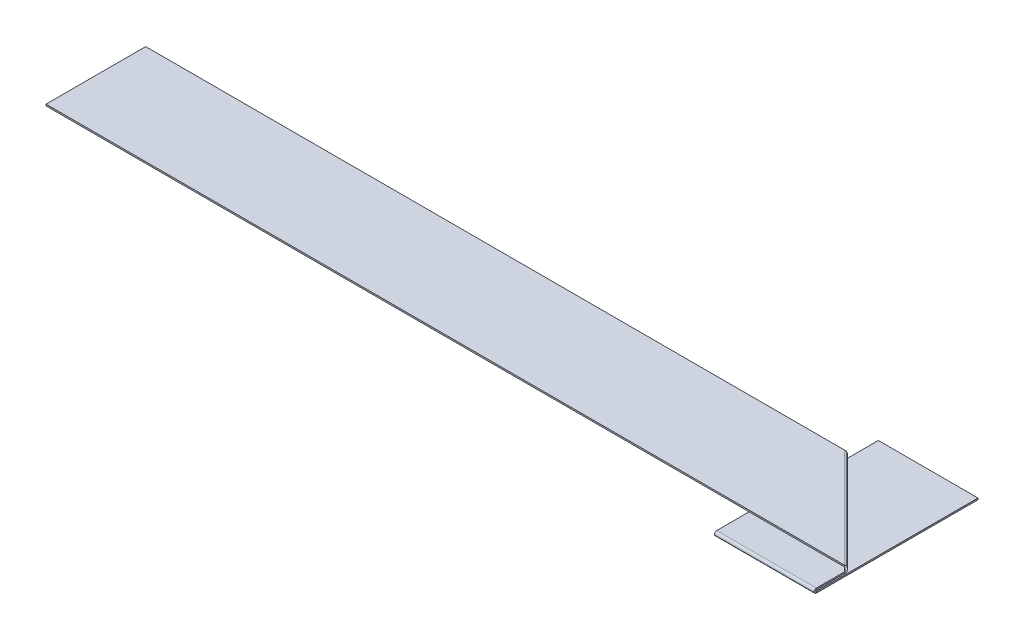
ISO-10303-21;
HEADER;
FILE_DESCRIPTION(('STEP AP214'),'2;1');
FILE_NAME('part.step','',(''),(''),'','','');
FILE_SCHEMA(('AUTOMOTIVE_DESIGN { 1 0 10303 214 1 1 1 1 }'));
ENDSEC;
DATA;
#1=APPLICATION_CONTEXT('core data for automotive mechanical design processes');
#2=APPLICATION_PROTOCOL_DEFINITION('international standard','automotive_design',2000,#1);
#3=PRODUCT_CONTEXT('',#1,'mechanical');
#4=PRODUCT('Part','Part','',(#3));
#5=PRODUCT_RELATED_PRODUCT_CATEGORY('part','',(#4));
#6=PRODUCT_DEFINITION_FORMATION('','',#4);
#7=PRODUCT_DEFINITION_CONTEXT('part definition',#1,'design');
#8=PRODUCT_DEFINITION('design','',#6,#7);
#9=PRODUCT_DEFINITION_SHAPE('','',#8);
#10=(LENGTH_UNIT() NAMED_UNIT(*) SI_UNIT(.MILLI.,.METRE.));
#11=(NAMED_UNIT(*) PLANE_ANGLE_UNIT() SI_UNIT($,.RADIAN.));
#12=(NAMED_UNIT(*) SI_UNIT($,.STERADIAN.) SOLID_ANGLE_UNIT());
#13=UNCERTAINTY_MEASURE_WITH_UNIT(LENGTH_MEASURE(1.E-05),#10,'distance_accuracy_value','');
#14=(GEOMETRIC_REPRESENTATION_CONTEXT(3) GLOBAL_UNCERTAINTY_ASSIGNED_CONTEXT((#13)) GLOBAL_UNIT_ASSIGNED_CONTEXT((#10,
#11,#12)) REPRESENTATION_CONTEXT('',''));
#15=CARTESIAN_POINT('',(0.,0.,0.));
#16=DIRECTION('',(0.,0.,1.));
#17=DIRECTION('',(1.,0.,0.));
#18=AXIS2_PLACEMENT_3D('',#15,#16,#17);
#19=CARTESIAN_POINT('',(0.,0.700000000000186,52.6));
#20=DIRECTION('',(0.,-1.,0.));
#21=DIRECTION('',(0.,0.,-1.));
#22=AXIS2_PLACEMENT_3D('',#19,#20,#21);
#23=PLANE('',#22);
#24=DIRECTION('',(0.,0.,-1.));
#25=VECTOR('',#24,1.);
#26=CARTESIAN_POINT('',(16.,0.700000000000186,52.6));
#27=LINE('',#26,#25);
#28=CARTESIAN_POINT('',(16.,0.7,25.9465708264711));
#29=VERTEX_POINT('',#28);
#30=CARTESIAN_POINT('',(16.,0.699999999999969,21.4463951570139));
#31=VERTEX_POINT('',#30);
#32=EDGE_CURVE('E80',#29,#31,#27,.T.);
#33=ORIENTED_EDGE('',*,*,#32,.T.);
#34=DIRECTION('',(-0.707106781186553,0.,-0.707106781186542));
#35=VECTOR('',#34,1.);
#36=CARTESIAN_POINT('',(23.5768024214929,0.700000000000022,29.0231975785067));
#37=LINE('',#36,#35);
#38=CARTESIAN_POINT('',(0.,0.699999999999857,5.44639515701414));
#39=VERTEX_POINT('',#38);
#40=EDGE_CURVE('E73',#31,#39,#37,.T.);
#41=ORIENTED_EDGE('',*,*,#40,.T.);
#42=DIRECTION('',(0.,0.,1.));
#43=VECTOR('',#42,1.);
#44=CARTESIAN_POINT('',(0.,0.700000000000186,52.6));
#45=LINE('',#44,#43);
#46=CARTESIAN_POINT('',(0.,0.7,25.9465708264711));
#47=VERTEX_POINT('',#46);
#48=EDGE_CURVE('E88',#39,#47,#45,.T.);
#49=ORIENTED_EDGE('',*,*,#48,.T.);
#50=DIRECTION('',(-1.,0.,0.));
#51=VECTOR('',#50,1.);
#52=CARTESIAN_POINT('',(0.,0.7,25.9465708264711));
#53=LINE('',#52,#51);
#54=EDGE_CURVE('E350',#29,#47,#53,.T.);
#55=ORIENTED_EDGE('',*,*,#54,.F.);
#56=EDGE_LOOP('',(#33,#41,#49,#55));
#57=FACE_BOUND('',#56,.T.);
#58=ADVANCED_FACE('F61',(#57),#23,.F.);
#59=CARTESIAN_POINT('',(0.,0.450000000000186,52.6));
#60=DIRECTION('',(-1.,0.,0.));
#61=DIRECTION('',(0.,0.,-1.));
#62=AXIS2_PLACEMENT_3D('',#59,#60,#61);
#63=PLANE('',#62);
#64=CARTESIAN_POINT('',(0.,0.449999999999857,5.44639515701415));
#65=CARTESIAN_POINT('',(0.,0.699999999999857,5.44639515701415));
#66=B_SPLINE_CURVE_WITH_KNOTS('',1,(#64,#65),.UNSPECIFIED.,.F.,.F.,(2,2),(0.,1.),.UNSPECIFIED.);
#67=CARTESIAN_POINT('',(0.,0.449999999999857,5.44639515701414));
#68=VERTEX_POINT('',#67);
#69=EDGE_CURVE('E291',#68,#39,#66,.T.);
#70=ORIENTED_EDGE('',*,*,#69,.F.);
#71=DIRECTION('',(0.,0.,1.));
#72=VECTOR('',#71,1.);
#73=CARTESIAN_POINT('',(0.,0.450000000000186,52.6));
#74=LINE('',#73,#72);
#75=CARTESIAN_POINT('',(0.,0.45,25.9465708264711));
#76=VERTEX_POINT('',#75);
#77=EDGE_CURVE('E357',#68,#76,#74,.T.);
#78=ORIENTED_EDGE('',*,*,#77,.T.);
#79=DIRECTION('',(0.,1.,0.));
#80=VECTOR('',#79,1.);
#81=CARTESIAN_POINT('',(0.,0.449999999999998,25.9465708264711));
#82=LINE('',#81,#80);
#83=EDGE_CURVE('E353',#76,#47,#82,.T.);
#84=ORIENTED_EDGE('',*,*,#83,.T.);
#85=ORIENTED_EDGE('',*,*,#48,.F.);
#86=EDGE_LOOP('',(#70,#78,#84,#85));
#87=FACE_BOUND('',#86,.T.);
#88=ADVANCED_FACE('F388',(#87),#63,.T.);
#89=CARTESIAN_POINT('',(16.,0.450000000000186,52.6));
#90=DIRECTION('',(1.,0.,0.));
#91=DIRECTION('',(0.,0.,1.));
#92=AXIS2_PLACEMENT_3D('',#89,#90,#91);
#93=PLANE('',#92);
#94=CARTESIAN_POINT('',(16.,0.699999999999969,21.4463951570139));
#95=CARTESIAN_POINT('',(16.,0.449999999999969,21.4463951570139));
#96=B_SPLINE_CURVE_WITH_KNOTS('',1,(#94,#95),.UNSPECIFIED.,.F.,.F.,(2,2),(0.,1.),.UNSPECIFIED.);
#97=CARTESIAN_POINT('',(16.,0.449999999999969,21.4463951570139));
#98=VERTEX_POINT('',#97);
#99=EDGE_CURVE('E12',#31,#98,#96,.T.);
#100=ORIENTED_EDGE('',*,*,#99,.F.);
#101=ORIENTED_EDGE('',*,*,#32,.F.);
#102=DIRECTION('',(0.,-1.,0.));
#103=VECTOR('',#102,1.);
#104=CARTESIAN_POINT('',(16.,0.449999999999998,25.9465708264712));
#105=LINE('',#104,#103);
#106=CARTESIAN_POINT('',(16.,0.45,25.9465708264711));
#107=VERTEX_POINT('',#106);
#108=EDGE_CURVE('E346',#29,#107,#105,.T.);
#109=ORIENTED_EDGE('',*,*,#108,.T.);
#110=DIRECTION('',(0.,0.,-1.));
#111=VECTOR('',#110,1.);
#112=CARTESIAN_POINT('',(16.,0.450000000000186,52.6));
#113=LINE('',#112,#111);
#114=EDGE_CURVE('E347',#107,#98,#113,.T.);
#115=ORIENTED_EDGE('',*,*,#114,.T.);
#116=EDGE_LOOP('',(#100,#101,#109,#115));
#117=FACE_BOUND('',#116,.T.);
#118=ADVANCED_FACE('F63',(#117),#93,.T.);
#119=CARTESIAN_POINT('',(0.,0.450000000000186,52.6));
#120=DIRECTION('',(0.,-1.,0.));
#121=DIRECTION('',(0.,0.,-1.));
#122=AXIS2_PLACEMENT_3D('',#119,#120,#121);
#123=PLANE('',#122);
#124=DIRECTION('',(-0.707106781186553,0.,-0.707106781186542));
#125=VECTOR('',#124,1.);
#126=CARTESIAN_POINT('',(23.5768024214929,0.450000000000021,29.0231975785067));
#127=LINE('',#126,#125);
#128=EDGE_CURVE('E355',#98,#68,#127,.T.);
#129=ORIENTED_EDGE('',*,*,#128,.F.);
#130=ORIENTED_EDGE('',*,*,#114,.F.);
#131=DIRECTION('',(-1.,0.,0.));
#132=VECTOR('',#131,1.);
#133=CARTESIAN_POINT('',(0.,0.45,25.9465708264711));
#134=LINE('',#133,#132);
#135=EDGE_CURVE('E343',#107,#76,#134,.T.);
#136=ORIENTED_EDGE('',*,*,#135,.T.);
#137=ORIENTED_EDGE('',*,*,#77,.F.);
#138=EDGE_LOOP('',(#129,#130,#136,#137));
#139=FACE_BOUND('',#138,.T.);
#140=ADVANCED_FACE('F397',(#139),#123,.T.);
#141=CARTESIAN_POINT('',(0.,0.25,0.));
#142=DIRECTION('',(0.,0.,-1.));
#143=DIRECTION('',(-1.,0.,0.));
#144=AXIS2_PLACEMENT_3D('',#141,#142,#143);
#145=PLANE('',#144);
#146=DIRECTION('',(1.,0.,0.));
#147=VECTOR('',#146,1.);
#148=CARTESIAN_POINT('',(0.,0.,0.));
#149=LINE('',#148,#147);
#150=CARTESIAN_POINT('',(0.,0.,0.));
#151=VERTEX_POINT('',#150);
#152=CARTESIAN_POINT('',(16.,0.,0.));
#153=VERTEX_POINT('',#152);
#154=EDGE_CURVE('E318',#151,#153,#149,.T.);
#155=ORIENTED_EDGE('',*,*,#154,.F.);
#156=DIRECTION('',(0.,-1.,0.));
#157=VECTOR('',#156,1.);
#158=CARTESIAN_POINT('',(0.,0.25,0.));
#159=LINE('',#158,#157);
#160=CARTESIAN_POINT('',(0.,0.25,0.));
#161=VERTEX_POINT('',#160);
#162=EDGE_CURVE('E313',#161,#151,#159,.T.);
#163=ORIENTED_EDGE('',*,*,#162,.F.);
#164=DIRECTION('',(1.,0.,0.));
#165=VECTOR('',#164,1.);
#166=CARTESIAN_POINT('',(0.,0.25,0.));
#167=LINE('',#166,#165);
#168=CARTESIAN_POINT('',(16.,0.25,0.));
#169=VERTEX_POINT('',#168);
#170=EDGE_CURVE('E332',#161,#169,#167,.T.);
#171=ORIENTED_EDGE('',*,*,#170,.T.);
#172=DIRECTION('',(0.,-1.,0.));
#173=VECTOR('',#172,1.);
#174=CARTESIAN_POINT('',(16.,0.25,0.));
#175=LINE('',#174,#173);
#176=EDGE_CURVE('E330',#169,#153,#175,.T.);
#177=ORIENTED_EDGE('',*,*,#176,.T.);
#178=EDGE_LOOP('',(#155,#163,#171,#177));
#179=FACE_BOUND('',#178,.T.);
#180=ADVANCED_FACE('F419',(#179),#145,.T.);
#181=CARTESIAN_POINT('',(0.,0.25,0.));
#182=DIRECTION('',(0.,1.,0.));
#183=DIRECTION('',(0.,0.,1.));
#184=AXIS2_PLACEMENT_3D('',#181,#182,#183);
#185=PLANE('',#184);
#186=DIRECTION('',(-1.,0.,0.));
#187=VECTOR('',#186,1.);
#188=CARTESIAN_POINT('',(0.,0.25,25.9465708264711));
#189=LINE('',#188,#187);
#190=CARTESIAN_POINT('',(16.,0.25,25.9465708264711));
#191=VERTEX_POINT('',#190);
#192=CARTESIAN_POINT('',(0.,0.25,25.9465708264711));
#193=VERTEX_POINT('',#192);
#194=EDGE_CURVE('E307',#191,#193,#189,.T.);
#195=ORIENTED_EDGE('',*,*,#194,.F.);
#196=DIRECTION('',(0.,0.,1.));
#197=VECTOR('',#196,1.);
#198=CARTESIAN_POINT('',(16.,0.25,0.));
#199=LINE('',#198,#197);
#200=EDGE_CURVE('E328',#169,#191,#199,.T.);
#201=ORIENTED_EDGE('',*,*,#200,.F.);
#202=ORIENTED_EDGE('',*,*,#170,.F.);
#203=DIRECTION('',(0.,0.,-1.));
#204=VECTOR('',#203,1.);
#205=CARTESIAN_POINT('',(0.,0.25,0.));
#206=LINE('',#205,#204);
#207=EDGE_CURVE('E316',#193,#161,#206,.T.);
#208=ORIENTED_EDGE('',*,*,#207,.F.);
#209=EDGE_LOOP('',(#195,#201,#202,#208));
#210=FACE_BOUND('',#209,.T.);
#211=ADVANCED_FACE('F427',(#210),#185,.T.);
#212=CARTESIAN_POINT('',(16.,0.25,0.));
#213=DIRECTION('',(1.,0.,0.));
#214=DIRECTION('',(0.,0.,-1.));
#215=AXIS2_PLACEMENT_3D('',#212,#213,#214);
#216=PLANE('',#215);
#217=DIRECTION('',(0.,1.,0.));
#218=VECTOR('',#217,1.);
#219=CARTESIAN_POINT('',(16.,0.250000000000002,25.9465708264711));
#220=LINE('',#219,#218);
#221=CARTESIAN_POINT('',(16.,0.,25.9465708264711));
#222=VERTEX_POINT('',#221);
#223=EDGE_CURVE('E335',#222,#191,#220,.T.);
#224=ORIENTED_EDGE('',*,*,#223,.F.);
#225=DIRECTION('',(0.,0.,1.));
#226=VECTOR('',#225,1.);
#227=CARTESIAN_POINT('',(16.,0.,0.));
#228=LINE('',#227,#226);
#229=EDGE_CURVE('E326',#153,#222,#228,.T.);
#230=ORIENTED_EDGE('',*,*,#229,.F.);
#231=ORIENTED_EDGE('',*,*,#176,.F.);
#232=ORIENTED_EDGE('',*,*,#200,.T.);
#233=EDGE_LOOP('',(#224,#230,#231,#232));
#234=FACE_BOUND('',#233,.T.);
#235=ADVANCED_FACE('F435',(#234),#216,.T.);
#236=CARTESIAN_POINT('',(0.,0.,0.));
#237=DIRECTION('',(0.,1.,0.));
#238=DIRECTION('',(0.,0.,1.));
#239=AXIS2_PLACEMENT_3D('',#236,#237,#238);
#240=PLANE('',#239);
#241=ORIENTED_EDGE('',*,*,#229,.T.);
#242=DIRECTION('',(-1.,0.,0.));
#243=VECTOR('',#242,1.);
#244=CARTESIAN_POINT('',(0.,0.,25.9465708264711));
#245=LINE('',#244,#243);
#246=CARTESIAN_POINT('',(0.,0.,25.9465708264711));
#247=VERTEX_POINT('',#246);
#248=EDGE_CURVE('E323',#222,#247,#245,.T.);
#249=ORIENTED_EDGE('',*,*,#248,.T.);
#250=DIRECTION('',(0.,0.,-1.));
#251=VECTOR('',#250,1.);
#252=CARTESIAN_POINT('',(0.,0.,0.));
#253=LINE('',#252,#251);
#254=EDGE_CURVE('E321',#247,#151,#253,.T.);
#255=ORIENTED_EDGE('',*,*,#254,.T.);
#256=ORIENTED_EDGE('',*,*,#154,.T.);
#257=EDGE_LOOP('',(#241,#249,#255,#256));
#258=FACE_BOUND('',#257,.T.);
#259=ADVANCED_FACE('F443',(#258),#240,.F.);
#260=CARTESIAN_POINT('',(0.,0.25,0.));
#261=DIRECTION('',(-1.,0.,0.));
#262=DIRECTION('',(0.,0.,1.));
#263=AXIS2_PLACEMENT_3D('',#260,#261,#262);
#264=PLANE('',#263);
#265=DIRECTION('',(0.,-1.,0.));
#266=VECTOR('',#265,1.);
#267=CARTESIAN_POINT('',(0.,0.250000000000002,25.9465708264711));
#268=LINE('',#267,#266);
#269=EDGE_CURVE('E338',#193,#247,#268,.T.);
#270=ORIENTED_EDGE('',*,*,#269,.F.);
#271=ORIENTED_EDGE('',*,*,#207,.T.);
#272=ORIENTED_EDGE('',*,*,#162,.T.);
#273=ORIENTED_EDGE('',*,*,#254,.F.);
#274=EDGE_LOOP('',(#270,#271,#272,#273));
#275=FACE_BOUND('',#274,.T.);
#276=ADVANCED_FACE('F452',(#275),#264,.T.);
#277=CARTESIAN_POINT('',(16.,0.35,25.9465708264712));
#278=DIRECTION('',(-1.,0.,0.));
#279=DIRECTION('',(0.,0.,1.));
#280=AXIS2_PLACEMENT_3D('',#277,#278,#279);
#281=PLANE('',#280);
#282=ORIENTED_EDGE('',*,*,#108,.F.);
#283=CARTESIAN_POINT('',(16.,0.35,25.9465708264712));
#284=DIRECTION('',(1.,0.,0.));
#285=DIRECTION('',(0.,0.,-1.));
#286=AXIS2_PLACEMENT_3D('',#283,#284,#285);
#287=CIRCLE('',#286,0.35);
#288=EDGE_CURVE('E308',#29,#222,#287,.T.);
#289=ORIENTED_EDGE('',*,*,#288,.T.);
#290=ORIENTED_EDGE('',*,*,#223,.T.);
#291=CARTESIAN_POINT('',(16.,0.35,25.9465708264712));
#292=DIRECTION('',(1.,0.,0.));
#293=DIRECTION('',(0.,0.,1.));
#294=AXIS2_PLACEMENT_3D('',#291,#292,#293);
#295=CIRCLE('',#294,0.1);
#296=EDGE_CURVE('E295',#107,#191,#295,.T.);
#297=ORIENTED_EDGE('',*,*,#296,.F.);
#298=EDGE_LOOP('',(#282,#289,#290,#297));
#299=FACE_BOUND('',#298,.T.);
#300=ADVANCED_FACE('F460',(#299),#281,.F.);
#301=CARTESIAN_POINT('',(0.,0.35,25.9465708264711));
#302=DIRECTION('',(1.,0.,0.));
#303=DIRECTION('',(0.,0.,-1.));
#304=AXIS2_PLACEMENT_3D('',#301,#302,#303);
#305=PLANE('',#304);
#306=CARTESIAN_POINT('',(0.,0.35,25.9465708264711));
#307=DIRECTION('',(1.,0.,0.));
#308=DIRECTION('',(0.,0.,-1.));
#309=AXIS2_PLACEMENT_3D('',#306,#307,#308);
#310=CIRCLE('',#309,0.35);
#311=EDGE_CURVE('E304',#247,#47,#310,.F.);
#312=ORIENTED_EDGE('',*,*,#311,.T.);
#313=ORIENTED_EDGE('',*,*,#83,.F.);
#314=CARTESIAN_POINT('',(0.,0.35,25.9465708264711));
#315=DIRECTION('',(-1.,0.,0.));
#316=DIRECTION('',(0.,0.,-1.));
#317=AXIS2_PLACEMENT_3D('',#314,#315,#316);
#318=CIRCLE('',#317,0.1);
#319=EDGE_CURVE('E303',#193,#76,#318,.T.);
#320=ORIENTED_EDGE('',*,*,#319,.F.);
#321=ORIENTED_EDGE('',*,*,#269,.T.);
#322=EDGE_LOOP('',(#312,#313,#320,#321));
#323=FACE_BOUND('',#322,.T.);
#324=ADVANCED_FACE('F467',(#323),#305,.F.);
#325=CARTESIAN_POINT('',(-8.01755751426557,0.35,25.9465708264711));
#326=DIRECTION('',(1.,0.,0.));
#327=DIRECTION('',(0.,0.,-1.));
#328=AXIS2_PLACEMENT_3D('',#325,#326,#327);
#329=CYLINDRICAL_SURFACE('',#328,0.1);
#330=ORIENTED_EDGE('',*,*,#194,.T.);
#331=ORIENTED_EDGE('',*,*,#319,.T.);
#332=ORIENTED_EDGE('',*,*,#135,.F.);
#333=ORIENTED_EDGE('',*,*,#296,.T.);
#334=EDGE_LOOP('',(#330,#331,#332,#333));
#335=FACE_BOUND('',#334,.T.);
#336=ADVANCED_FACE('F266',(#335),#329,.F.);
#337=CARTESIAN_POINT('',(-8.01755751426557,0.35,25.9465708264711));
#338=DIRECTION('',(1.,0.,0.));
#339=DIRECTION('',(0.,0.,-1.));
#340=AXIS2_PLACEMENT_3D('',#337,#338,#339);
#341=CYLINDRICAL_SURFACE('',#340,0.35);
#342=ORIENTED_EDGE('',*,*,#248,.F.);
#343=ORIENTED_EDGE('',*,*,#288,.F.);
#344=ORIENTED_EDGE('',*,*,#54,.T.);
#345=ORIENTED_EDGE('',*,*,#311,.F.);
#346=EDGE_LOOP('',(#342,#343,#344,#345));
#347=FACE_BOUND('',#346,.T.);
#348=ADVANCED_FACE('F484',(#347),#341,.T.);
#349=CARTESIAN_POINT('',(15.5001756694572,1.14999999999997,20.9465708264711));
#350=CARTESIAN_POINT('',(15.5537921167778,1.14999999999996,20.9188467692402));
#351=CARTESIAN_POINT('',(15.6101453208639,1.13555392953662,20.8940041537715));
#352=CARTESIAN_POINT('',(15.7189385122351,1.08115460482736,20.8595312620026));
#353=CARTESIAN_POINT('',(15.7712872506304,1.0412542066912,20.8499817803735));
#354=CARTESIAN_POINT('',(15.8646371181393,0.945401271251339,20.8535086403268));
#355=CARTESIAN_POINT('',(15.9055946098397,0.889541867676821,20.8666286193227));
#356=CARTESIAN_POINT('',(15.9434051297206,0.825137932580983,20.8959992493107));
#357=CARTESIAN_POINT('',(15.9474944555388,0.817961511614403,20.8994626067464));
#358=CARTESIAN_POINT('',(15.9524655671429,0.8089824600218,20.9040424880177));
#359=CARTESIAN_POINT('',(15.9534527650753,0.807186223669707,20.9049709956008));
#360=CARTESIAN_POINT('',(15.9554131052041,0.803593324876628,20.9068530803838));
#361=CARTESIAN_POINT('',(15.956798330561,0.801030319156768,20.9082187407443));
#362=CARTESIAN_POINT('',(15.9584604205842,0.797939361686363,20.9098808307675));
#363=CARTESIAN_POINT('',(15.9595718933146,0.795873565119803,20.911018040061));
#364=CARTESIAN_POINT('',(15.965145362113,0.785520422303536,20.9168507913483));
#365=CARTESIAN_POINT('',(15.9696556014412,0.777160402469436,20.9219865199785));
#366=CARTESIAN_POINT('',(15.9787555724703,0.760330208947424,20.9332204686465));
#367=CARTESIAN_POINT('',(15.9833452894171,0.751860036432698,20.9393187034382));
#368=CARTESIAN_POINT('',(15.9902734569162,0.739109515057901,20.949203951382));
#369=CARTESIAN_POINT('',(15.9925901291823,0.73485183603946,20.9526219989027));
#370=CARTESIAN_POINT('',(15.9960742359463,0.728459072471622,20.9579353437777));
#371=CARTESIAN_POINT('',(15.9972371225514,0.72632711281429,20.9597375030454));
#372=CARTESIAN_POINT('',(15.9995656428449,0.722061980314015,20.9634041984837));
#373=CARTESIAN_POINT('',(16.0010711164158,0.719307492132631,20.9658208875552));
#374=CARTESIAN_POINT('',(16.0283630676478,0.669410737341268,21.0101633255908));
#375=CARTESIAN_POINT('',(16.04743163502,0.60799594815056,21.0656042844826));
#376=CARTESIAN_POINT('',(16.0493082551769,0.497799445239296,21.2228384689838));
#377=CARTESIAN_POINT('',(16.030346900834,0.449999999999967,21.325377274625));
#378=CARTESIAN_POINT('',(16.,0.449999999999969,21.4463951570139));
#379=CARTESIAN_POINT('',(15.5001756694572,0.899999999999965,20.9465708264711));
#380=CARTESIAN_POINT('',(15.524736891742,0.899999999999965,20.9478966771094));
#381=CARTESIAN_POINT('',(15.5520966336831,0.895872551296153,20.9520528409523));
#382=CARTESIAN_POINT('',(15.60972336679,0.880329887093508,20.9687464074477));
#383=CARTESIAN_POINT('',(15.6399655980337,0.868929773340319,20.9813034329702));
#384=CARTESIAN_POINT('',(15.7012358199871,0.841543220357502,21.0169099384791));
#385=CARTESIAN_POINT('',(15.7322513428644,0.825583390764782,21.039971886298));
#386=CARTESIAN_POINT('',(15.767047616355,0.807182266451686,21.0723567626763));
#387=CARTESIAN_POINT('',(15.7709133820366,0.805131860461234,21.0760436802487));
#388=CARTESIAN_POINT('',(15.7757447685218,0.802566417149062,21.0807632866388));
#389=CARTESIAN_POINT('',(15.7767110056152,0.80205320676275,21.081712755061));
#390=CARTESIAN_POINT('',(15.7786433974061,0.801026664250441,21.0836227881817));
#391=CARTESIAN_POINT('',(15.7800216352644,0.80029437690191,21.084995436041));
#392=CARTESIAN_POINT('',(15.7816837252875,0.79941124619608,21.0866575260641));
#393=CARTESIAN_POINT('',(15.7828043896477,0.798821018605634,21.087785543728));
#394=CARTESIAN_POINT('',(15.7884704593349,0.795862977800986,21.0935256941263));
#395=CARTESIAN_POINT('',(15.7932040876996,0.793474400705529,21.0984380337202));
#396=CARTESIAN_POINT('',(15.8030661935997,0.788665773984955,21.1089098475171));
#397=CARTESIAN_POINT('',(15.8081946669197,0.786245724695033,21.1144693259357));
#398=CARTESIAN_POINT('',(15.8161789345776,0.782602718587948,21.1232984737206));
#399=CARTESIAN_POINT('',(15.8188889551489,0.781386238868394,21.1263231729361));
#400=CARTESIAN_POINT('',(15.8230263612382,0.779559734991869,21.1309832184857));
#401=CARTESIAN_POINT('',(15.8244175595085,0.778950603661202,21.1325570660882));
#402=CARTESIAN_POINT('',(15.8272239994966,0.777731994375409,21.1357458418319));
#403=CARTESIAN_POINT('',(15.8290549071749,0.776944997752157,21.1378370967961));
#404=CARTESIAN_POINT('',(15.8624363179796,0.762688782097482,21.176090075259));
#405=CARTESIAN_POINT('',(15.8944950251802,0.745141699471565,21.2185408943223));
#406=CARTESIAN_POINT('',(15.9518564897458,0.713656984354062,21.3202902344148));
#407=CARTESIAN_POINT('',(15.9764883683094,0.699999999999968,21.38000179587));
#408=CARTESIAN_POINT('',(16.,0.699999999999969,21.4463951570139));
#409=B_SPLINE_SURFACE_WITH_KNOTS('',1,3,((#349,#350,#351,#352,#353,#354,#355,#356,#357,#358,
#359,#360,#361,#362,#363,#364,#365,#366,#367,#368,#369,#370,#371,#372,#373,#374,#375,#376,#377,
#378),(#379,#380,#381,#382,#383,#384,#385,#386,#387,#388,#389,#390,#391,#392,#393,#394,#395,
#396,#397,#398,#399,#400,#401,#402,#403,#404,#405,#406,#407,#408)),.UNSPECIFIED.,.F.,.F.,.F.,(2,
2),(4,2,2,2,2,2,2,2,2,2,2,2,2,2,4),(0.,1.),(0.,0.125,0.25,0.375,0.390625,0.39453125,0.3984375,
0.40625,0.4375,0.46875,0.484375,0.4921875,0.5,0.75,1.),.UNSPECIFIED.);
#410=CARTESIAN_POINT('',(15.5001756694572,1.14999999999997,20.9465708264711));
#411=CARTESIAN_POINT('',(15.5001756694572,0.899999999999965,20.9465708264711));
#412=B_SPLINE_CURVE_WITH_KNOTS('',1,(#410,#411),.UNSPECIFIED.,.F.,.F.,(2,2),(0.,1.),.UNSPECIFIED.);
#413=CARTESIAN_POINT('',(15.5001756694572,0.899999999999965,20.9465708264711));
#414=VERTEX_POINT('',#413);
#415=CARTESIAN_POINT('',(15.5001756694572,1.14999999999997,20.9465708264711));
#416=VERTEX_POINT('',#415);
#417=EDGE_CURVE('E162',#414,#416,#412,.F.);
#418=CARTESIAN_POINT('',(15.5001756694572,0.899999999999965,20.9465708264711));
#419=CARTESIAN_POINT('',(15.524736891742,0.899999999999965,20.9478966771094));
#420=CARTESIAN_POINT('',(15.5520966336831,0.895872551296153,20.9520528409523));
#421=CARTESIAN_POINT('',(15.60972336679,0.880329887093508,20.9687464074477));
#422=CARTESIAN_POINT('',(15.6399655980337,0.868929773340319,20.9813034329702));
#423=CARTESIAN_POINT('',(15.7012358199871,0.841543220357502,21.0169099384791));
#424=CARTESIAN_POINT('',(15.7322513428644,0.825583390764782,21.039971886298));
#425=CARTESIAN_POINT('',(15.767047616355,0.807182266451686,21.0723567626763));
#426=CARTESIAN_POINT('',(15.7709133820366,0.805131860461234,21.0760436802487));
#427=CARTESIAN_POINT('',(15.7757447685218,0.802566417149062,21.0807632866388));
#428=CARTESIAN_POINT('',(15.7767110056152,0.80205320676275,21.081712755061));
#429=CARTESIAN_POINT('',(15.7786433974061,0.801026664250441,21.0836227881817));
#430=CARTESIAN_POINT('',(15.7800216352644,0.80029437690191,21.084995436041));
#431=CARTESIAN_POINT('',(15.7816837252875,0.79941124619608,21.0866575260641));
#432=CARTESIAN_POINT('',(15.7828043896477,0.798821018605634,21.087785543728));
#433=CARTESIAN_POINT('',(15.7884704593349,0.795862977800986,21.0935256941263));
#434=CARTESIAN_POINT('',(15.7932040876996,0.793474400705529,21.0984380337202));
#435=CARTESIAN_POINT('',(15.8030661935997,0.788665773984955,21.1089098475171));
#436=CARTESIAN_POINT('',(15.8081946669197,0.786245724695033,21.1144693259357));
#437=CARTESIAN_POINT('',(15.8161789345776,0.782602718587948,21.1232984737206));
#438=CARTESIAN_POINT('',(15.8188889551489,0.781386238868394,21.1263231729361));
#439=CARTESIAN_POINT('',(15.8230263612382,0.779559734991869,21.1309832184857));
#440=CARTESIAN_POINT('',(15.8244175595085,0.778950603661202,21.1325570660882));
#441=CARTESIAN_POINT('',(15.8272239994966,0.777731994375409,21.1357458418319));
#442=CARTESIAN_POINT('',(15.8290549071749,0.776944997752157,21.1378370967961));
#443=CARTESIAN_POINT('',(15.8624363179796,0.762688782097482,21.176090075259));
#444=CARTESIAN_POINT('',(15.8944950251802,0.745141699471565,21.2185408943223));
#445=CARTESIAN_POINT('',(15.9518564897458,0.713656984354062,21.3202902344148));
#446=CARTESIAN_POINT('',(15.9764883683094,0.699999999999968,21.38000179587));
#447=CARTESIAN_POINT('',(16.,0.699999999999969,21.4463951570139));
#448=B_SPLINE_CURVE_WITH_KNOTS('',3,(#418,#419,#420,#421,#422,#423,#424,#425,#426,#427,#428,
#429,#430,#431,#432,#433,#434,#435,#436,#437,#438,#439,#440,#441,#442,#443,#444,#445,#446,#447),
.UNSPECIFIED.,.F.,.F.,(4,2,2,2,2,2,2,2,2,2,2,2,2,2,4),(0.,0.125,0.25,0.375,0.390625,0.39453125,
0.3984375,0.40625,0.4375,0.46875,0.484375,0.4921875,0.5,0.75,1.),.UNSPECIFIED.);
#449=EDGE_CURVE('E173',#414,#31,#448,.T.);
#450=CARTESIAN_POINT('',(16.,0.449999999999969,21.4463951570139));
#451=CARTESIAN_POINT('',(16.030346900834,0.449999999999967,21.325377274625));
#452=CARTESIAN_POINT('',(16.0493082551769,0.497799445239296,21.2228384689838));
#453=CARTESIAN_POINT('',(16.04743163502,0.60799594815056,21.0656042844826));
#454=CARTESIAN_POINT('',(16.0283630676478,0.669410737341268,21.0101633255908));
#455=CARTESIAN_POINT('',(16.0010711164158,0.719307492132631,20.9658208875552));
#456=CARTESIAN_POINT('',(15.9995656428449,0.722061980314015,20.9634041984837));
#457=CARTESIAN_POINT('',(15.9972371225514,0.72632711281429,20.9597375030454));
#458=CARTESIAN_POINT('',(15.9960742359463,0.728459072471622,20.9579353437777));
#459=CARTESIAN_POINT('',(15.9925901291823,0.73485183603946,20.9526219989027));
#460=CARTESIAN_POINT('',(15.9902734569162,0.739109515057901,20.949203951382));
#461=CARTESIAN_POINT('',(15.9833452894171,0.751860036432698,20.9393187034382));
#462=CARTESIAN_POINT('',(15.9787555724703,0.760330208947424,20.9332204686465));
#463=CARTESIAN_POINT('',(15.9696556014412,0.777160402469436,20.9219865199785));
#464=CARTESIAN_POINT('',(15.965145362113,0.785520422303536,20.9168507913483));
#465=CARTESIAN_POINT('',(15.9595718933146,0.795873565119803,20.911018040061));
#466=CARTESIAN_POINT('',(15.9584604205842,0.797939361686363,20.9098808307675));
#467=CARTESIAN_POINT('',(15.956798330561,0.801030319156768,20.9082187407443));
#468=CARTESIAN_POINT('',(15.9554131052041,0.803593324876628,20.9068530803838));
#469=CARTESIAN_POINT('',(15.9534527650753,0.807186223669707,20.9049709956008));
#470=CARTESIAN_POINT('',(15.9524655671429,0.8089824600218,20.9040424880177));
#471=CARTESIAN_POINT('',(15.9474944555388,0.817961511614403,20.8994626067464));
#472=CARTESIAN_POINT('',(15.9434051297206,0.825137932580983,20.8959992493107));
#473=CARTESIAN_POINT('',(15.9055946098397,0.889541867676821,20.8666286193227));
#474=CARTESIAN_POINT('',(15.8646371181393,0.945401271251339,20.8535086403268));
#475=CARTESIAN_POINT('',(15.7712872506304,1.0412542066912,20.8499817803735));
#476=CARTESIAN_POINT('',(15.7189385122351,1.08115460482736,20.8595312620026));
#477=CARTESIAN_POINT('',(15.6101453208639,1.13555392953662,20.8940041537715));
#478=CARTESIAN_POINT('',(15.5537921167778,1.14999999999996,20.9188467692402));
#479=CARTESIAN_POINT('',(15.5001756694572,1.14999999999997,20.9465708264711));
#480=B_SPLINE_CURVE_WITH_KNOTS('',3,(#450,#451,#452,#453,#454,#455,#456,#457,#458,#459,#460,
#461,#462,#463,#464,#465,#466,#467,#468,#469,#470,#471,#472,#473,#474,#475,#476,#477,#478,#479),
.UNSPECIFIED.,.F.,.F.,(4,2,2,2,2,2,2,2,2,2,2,2,2,2,4),(0.,0.25,0.5,0.5078125,0.515625,0.53125,
0.5625,0.59375,0.6015625,0.60546875,0.609375,0.625,0.75,0.875,1.),.UNSPECIFIED.);
#481=EDGE_CURVE('E692',#416,#98,#480,.F.);
#482=ORIENTED_EDGE('',*,*,#417,.F.);
#483=ORIENTED_EDGE('',*,*,#449,.T.);
#484=ORIENTED_EDGE('',*,*,#99,.T.);
#485=ORIENTED_EDGE('',*,*,#481,.F.);
#486=EDGE_LOOP('',(#482,#483,#484,#485));
#487=FACE_BOUND('',#486,.T.);
#488=ADVANCED_FACE('F262',(#487),#409,.T.);
#489=CARTESIAN_POINT('',(0.,0.449999999999857,5.44639515701415));
#490=CARTESIAN_POINT('',(0.0277240572302306,0.449999999999856,5.39277870969282));
#491=CARTESIAN_POINT('',(0.0525666726983777,0.464446070463198,5.33642550560617));
#492=CARTESIAN_POINT('',(0.0870395644667371,0.518845395172456,5.22763231423449));
#493=CARTESIAN_POINT('',(0.0965890460958461,0.558745793308619,5.17528357583914));
#494=CARTESIAN_POINT('',(0.0930621861428258,0.654598728748481,5.08193370833055));
#495=CARTESIAN_POINT('',(0.0799422071473748,0.710458132322999,5.04097621663062));
#496=CARTESIAN_POINT('',(0.0505715771601462,0.774862067418839,5.0031656967504));
#497=CARTESIAN_POINT('',(0.0471082197244624,0.782038488385419,4.99907637093227));
#498=CARTESIAN_POINT('',(0.0425283384532411,0.791017539978021,4.99410525932832));
#499=CARTESIAN_POINT('',(0.0415998308701916,0.792813776330115,4.99311806139595));
#500=CARTESIAN_POINT('',(0.0397177460872692,0.796406675123194,4.99115772126722));
#501=CARTESIAN_POINT('',(0.0383520857268205,0.798969680842937,4.98977249591037));
#502=CARTESIAN_POINT('',(0.0366899957035194,0.802060638313692,4.98811040588707));
#503=CARTESIAN_POINT('',(0.0355527864098715,0.804126434880469,4.98699893315654));
#504=CARTESIAN_POINT('',(0.0297200351222074,0.814479577697726,4.98142546435775));
#505=CARTESIAN_POINT('',(0.0245843064916406,0.822839597532326,4.97691522502939));
#506=CARTESIAN_POINT('',(0.0133503578233911,0.839669791054758,4.96781525400021));
#507=CARTESIAN_POINT('',(0.00725212303167213,0.848139963569403,4.96322553705345));
#508=CARTESIAN_POINT('',(-0.00263312491183633,0.860890484943654,4.95629736955456));
#509=CARTESIAN_POINT('',(-0.00605117243241564,0.865148163961842,4.95398069728857));
#510=CARTESIAN_POINT('',(-0.0113645173071304,0.871540927529198,4.95049659052476));
#511=CARTESIAN_POINT('',(-0.013166676574731,0.873672887186352,4.94933370391974));
#512=CARTESIAN_POINT('',(-0.0168333720128226,0.877938019686238,4.94700518362637));
#513=CARTESIAN_POINT('',(-0.0192500610849962,0.880692507868256,4.94549971005501));
#514=CARTESIAN_POINT('',(-0.0635924990905825,0.930589262624218,4.91820775884085));
#515=CARTESIAN_POINT('',(-0.11903345795612,0.992004051803425,4.89913919146563));
#516=CARTESIAN_POINT('',(-0.276267642445491,1.10220055473132,4.89726257129694));
#517=CARTESIAN_POINT('',(-0.378806448103792,1.14999999999985,4.91622392563519));
#518=CARTESIAN_POINT('',(-0.499824330542792,1.14999999999985,4.94657082647134));
#519=CARTESIAN_POINT('',(0.,0.699999999999857,5.44639515701415));
#520=CARTESIAN_POINT('',(-0.00132585063898564,0.699999999999857,5.4218339347286));
#521=CARTESIAN_POINT('',(-0.00548201448245698,0.704127448703668,5.394474192787));
#522=CARTESIAN_POINT('',(-0.0221755809783994,0.719670112906313,5.33684745967962));
#523=CARTESIAN_POINT('',(-0.0347326065008797,0.731070226659503,5.30660522843587));
#524=CARTESIAN_POINT('',(-0.0703391120094624,0.75845677964232,5.24533500648284));
#525=CARTESIAN_POINT('',(-0.0934010598279408,0.77441660923504,5.21431948360594));
#526=CARTESIAN_POINT('',(-0.125785936205522,0.792817733548137,5.17952321011607));
#527=CARTESIAN_POINT('',(-0.129472853777794,0.794868139538588,5.17565744443453));
#528=CARTESIAN_POINT('',(-0.134192460167847,0.79743358285076,5.17082605794941));
#529=CARTESIAN_POINT('',(-0.135141928589941,0.797946793237073,5.16985982085608));
#530=CARTESIAN_POINT('',(-0.137051961710651,0.798973335749381,5.16792742906514));
#531=CARTESIAN_POINT('',(-0.138424609569815,0.799705623097879,5.16654919120701));
#532=CARTESIAN_POINT('',(-0.140086699593116,0.800588753803809,5.1648871011837));
#533=CARTESIAN_POINT('',(-0.141214717257079,0.801178981394317,5.16376643682349));
#534=CARTESIAN_POINT('',(-0.146954867655859,0.804137022199247,5.15810036713582));
#535=CARTESIAN_POINT('',(-0.151867207249925,0.806525599294847,5.15336673877095));
#536=CARTESIAN_POINT('',(-0.162339021047075,0.811334226015542,5.14350463287068));
#537=CARTESIAN_POINT('',(-0.167898499465597,0.81375427530544,5.13837615955072));
#538=CARTESIAN_POINT('',(-0.17672764725031,0.817397281412369,5.13039189189304));
#539=CARTESIAN_POINT('',(-0.179752346465681,0.818613761131851,5.12768187132184));
#540=CARTESIAN_POINT('',(-0.184412392015073,0.820440265008239,5.1235444652327));
#541=CARTESIAN_POINT('',(-0.185986239617467,0.821049396338854,5.12215326696248));
#542=CARTESIAN_POINT('',(-0.189175015361015,0.822268005624536,5.11934682697456));
#543=CARTESIAN_POINT('',(-0.191266270325753,0.823055002247969,5.11751591929577));
#544=CARTESIAN_POINT('',(-0.229519248762973,0.83731121789253,5.08413450851325));
#545=CARTESIAN_POINT('',(-0.271970067810541,0.854858300515161,5.05207580132006));
#546=CARTESIAN_POINT('',(-0.373719407899672,0.886343015637416,4.99471433675112));
#547=CARTESIAN_POINT('',(-0.433430969368271,0.899999999999853,4.97008245817813));
#548=CARTESIAN_POINT('',(-0.499824330542792,0.899999999999853,4.94657082647134));
#549=B_SPLINE_SURFACE_WITH_KNOTS('',1,3,((#489,#490,#491,#492,#493,#494,#495,#496,#497,#498,
#499,#500,#501,#502,#503,#504,#505,#506,#507,#508,#509,#510,#511,#512,#513,#514,#515,#516,#517,
#518),(#519,#520,#521,#522,#523,#524,#525,#526,#527,#528,#529,#530,#531,#532,#533,#534,#535,
#536,#537,#538,#539,#540,#541,#542,#543,#544,#545,#546,#547,#548)),.UNSPECIFIED.,.F.,.F.,.F.,(2,
2),(4,2,2,2,2,2,2,2,2,2,2,2,2,2,4),(0.,1.),(0.,0.125,0.25,0.375,0.390625,0.39453125,0.3984375,
0.40625,0.4375,0.46875,0.484375,0.4921875,0.5,0.75,1.),.UNSPECIFIED.);
#550=CARTESIAN_POINT('',(0.,0.699999999999857,5.44639515701415));
#551=CARTESIAN_POINT('',(-0.00132585063898564,0.699999999999857,5.4218339347286));
#552=CARTESIAN_POINT('',(-0.00548201448245698,0.704127448703668,5.394474192787));
#553=CARTESIAN_POINT('',(-0.0221755809783994,0.719670112906313,5.33684745967962));
#554=CARTESIAN_POINT('',(-0.0347326065008797,0.731070226659503,5.30660522843587));
#555=CARTESIAN_POINT('',(-0.0703391120094624,0.75845677964232,5.24533500648284));
#556=CARTESIAN_POINT('',(-0.0934010598279408,0.77441660923504,5.21431948360594));
#557=CARTESIAN_POINT('',(-0.125785936205522,0.792817733548137,5.17952321011607));
#558=CARTESIAN_POINT('',(-0.129472853777794,0.794868139538588,5.17565744443453));
#559=CARTESIAN_POINT('',(-0.134192460167847,0.79743358285076,5.17082605794941));
#560=CARTESIAN_POINT('',(-0.135141928589941,0.797946793237073,5.16985982085608));
#561=CARTESIAN_POINT('',(-0.137051961710651,0.798973335749381,5.16792742906514));
#562=CARTESIAN_POINT('',(-0.138424609569815,0.799705623097879,5.16654919120701));
#563=CARTESIAN_POINT('',(-0.140086699593116,0.800588753803809,5.1648871011837));
#564=CARTESIAN_POINT('',(-0.141214717257079,0.801178981394317,5.16376643682349));
#565=CARTESIAN_POINT('',(-0.146954867655859,0.804137022199247,5.15810036713582));
#566=CARTESIAN_POINT('',(-0.151867207249925,0.806525599294847,5.15336673877095));
#567=CARTESIAN_POINT('',(-0.162339021047075,0.811334226015542,5.14350463287068));
#568=CARTESIAN_POINT('',(-0.167898499465597,0.81375427530544,5.13837615955072));
#569=CARTESIAN_POINT('',(-0.17672764725031,0.817397281412369,5.13039189189304));
#570=CARTESIAN_POINT('',(-0.179752346465681,0.818613761131851,5.12768187132184));
#571=CARTESIAN_POINT('',(-0.184412392015073,0.820440265008239,5.1235444652327));
#572=CARTESIAN_POINT('',(-0.185986239617467,0.821049396338854,5.12215326696248));
#573=CARTESIAN_POINT('',(-0.189175015361015,0.822268005624536,5.11934682697456));
#574=CARTESIAN_POINT('',(-0.191266270325753,0.823055002247969,5.11751591929577));
#575=CARTESIAN_POINT('',(-0.229519248762973,0.83731121789253,5.08413450851325));
#576=CARTESIAN_POINT('',(-0.271970067810541,0.854858300515161,5.05207580132006));
#577=CARTESIAN_POINT('',(-0.373719407899672,0.886343015637416,4.99471433675112));
#578=CARTESIAN_POINT('',(-0.433430969368271,0.899999999999853,4.97008245817813));
#579=CARTESIAN_POINT('',(-0.499824330542792,0.899999999999853,4.94657082647134));
#580=B_SPLINE_CURVE_WITH_KNOTS('',3,(#550,#551,#552,#553,#554,#555,#556,#557,#558,#559,#560,
#561,#562,#563,#564,#565,#566,#567,#568,#569,#570,#571,#572,#573,#574,#575,#576,#577,#578,#579),
.UNSPECIFIED.,.F.,.F.,(4,2,2,2,2,2,2,2,2,2,2,2,2,2,4),(0.,0.125,0.25,0.375,0.390625,0.39453125,
0.3984375,0.40625,0.4375,0.46875,0.484375,0.4921875,0.5,0.75,1.),.UNSPECIFIED.);
#581=CARTESIAN_POINT('',(-0.499824330542806,0.899999999999853,4.94657082647135));
#582=VERTEX_POINT('',#581);
#583=EDGE_CURVE('E234',#39,#582,#580,.T.);
#584=CARTESIAN_POINT('',(-0.499824330542792,0.899999999999853,4.94657082647134));
#585=CARTESIAN_POINT('',(-0.499824330542792,1.14999999999985,4.94657082647134));
#586=B_SPLINE_CURVE_WITH_KNOTS('',1,(#584,#585),.UNSPECIFIED.,.F.,.F.,(2,2),(0.,1.),.UNSPECIFIED.);
#587=CARTESIAN_POINT('',(-0.499824330542806,1.14999999999985,4.94657082647135));
#588=VERTEX_POINT('',#587);
#589=EDGE_CURVE('E680',#588,#582,#586,.F.);
#590=CARTESIAN_POINT('',(-0.499824330542792,1.14999999999985,4.94657082647134));
#591=CARTESIAN_POINT('',(-0.378806448103792,1.14999999999985,4.91622392563519));
#592=CARTESIAN_POINT('',(-0.276267642445491,1.10220055473132,4.89726257129694));
#593=CARTESIAN_POINT('',(-0.11903345795612,0.992004051803425,4.89913919146563));
#594=CARTESIAN_POINT('',(-0.0635924990905825,0.930589262624218,4.91820775884085));
#595=CARTESIAN_POINT('',(-0.0192500610849962,0.880692507868256,4.94549971005501));
#596=CARTESIAN_POINT('',(-0.0168333720128226,0.877938019686238,4.94700518362637));
#597=CARTESIAN_POINT('',(-0.013166676574731,0.873672887186352,4.94933370391974));
#598=CARTESIAN_POINT('',(-0.0113645173071304,0.871540927529198,4.95049659052476));
#599=CARTESIAN_POINT('',(-0.00605117243241564,0.865148163961842,4.95398069728857));
#600=CARTESIAN_POINT('',(-0.00263312491183633,0.860890484943654,4.95629736955456));
#601=CARTESIAN_POINT('',(0.00725212303167213,0.848139963569403,4.96322553705345));
#602=CARTESIAN_POINT('',(0.0133503578233911,0.839669791054758,4.96781525400021));
#603=CARTESIAN_POINT('',(0.0245843064916406,0.822839597532326,4.97691522502939));
#604=CARTESIAN_POINT('',(0.0297200351222074,0.814479577697726,4.98142546435775));
#605=CARTESIAN_POINT('',(0.0355527864098715,0.804126434880469,4.98699893315654));
#606=CARTESIAN_POINT('',(0.0366899957035194,0.802060638313692,4.98811040588707));
#607=CARTESIAN_POINT('',(0.0383520857268205,0.798969680842937,4.98977249591037));
#608=CARTESIAN_POINT('',(0.0397177460872692,0.796406675123194,4.99115772126722));
#609=CARTESIAN_POINT('',(0.0415998308701916,0.792813776330115,4.99311806139595));
#610=CARTESIAN_POINT('',(0.0425283384532411,0.791017539978021,4.99410525932832));
#611=CARTESIAN_POINT('',(0.0471082197244624,0.782038488385419,4.99907637093227));
#612=CARTESIAN_POINT('',(0.0505715771601462,0.774862067418839,5.0031656967504));
#613=CARTESIAN_POINT('',(0.0799422071473748,0.710458132322999,5.04097621663062));
#614=CARTESIAN_POINT('',(0.0930621861428258,0.654598728748481,5.08193370833055));
#615=CARTESIAN_POINT('',(0.0965890460958461,0.558745793308619,5.17528357583914));
#616=CARTESIAN_POINT('',(0.0870395644667371,0.518845395172456,5.22763231423449));
#617=CARTESIAN_POINT('',(0.0525666726983777,0.464446070463198,5.33642550560617));
#618=CARTESIAN_POINT('',(0.0277240572302306,0.449999999999856,5.39277870969282));
#619=CARTESIAN_POINT('',(0.,0.449999999999857,5.44639515701415));
#620=B_SPLINE_CURVE_WITH_KNOTS('',3,(#590,#591,#592,#593,#594,#595,#596,#597,#598,#599,#600,
#601,#602,#603,#604,#605,#606,#607,#608,#609,#610,#611,#612,#613,#614,#615,#616,#617,#618,#619),
.UNSPECIFIED.,.F.,.F.,(4,2,2,2,2,2,2,2,2,2,2,2,2,2,4),(0.,0.25,0.5,0.5078125,0.515625,0.53125,
0.5625,0.59375,0.6015625,0.60546875,0.609375,0.625,0.75,0.875,1.),.UNSPECIFIED.);
#621=EDGE_CURVE('E228',#68,#588,#620,.F.);
#622=ORIENTED_EDGE('',*,*,#583,.T.);
#623=ORIENTED_EDGE('',*,*,#589,.F.);
#624=ORIENTED_EDGE('',*,*,#621,.F.);
#625=ORIENTED_EDGE('',*,*,#69,.T.);
#626=EDGE_LOOP('',(#622,#623,#624,#625));
#627=FACE_BOUND('',#626,.T.);
#628=ADVANCED_FACE('F204',(#627),#549,.T.);
#629=CARTESIAN_POINT('',(-8.50833962881108,0.799999999999798,-3.06194447179683));
#630=DIRECTION('',(0.707106781186553,0.,0.707106781186542));
#631=DIRECTION('',(0.707106781186542,0.,-0.707106781186553));
#632=AXIS2_PLACEMENT_3D('',#629,#630,#631);
#633=CYLINDRICAL_SURFACE('',#632,0.35);
#634=ORIENTED_EDGE('',*,*,#128,.T.);
#635=ORIENTED_EDGE('',*,*,#621,.T.);
#636=DIRECTION('',(-0.707106781186553,0.,-0.707106781186542));
#637=VECTOR('',#636,1.);
#638=CARTESIAN_POINT('',(23.5768024214929,1.15000000000002,29.0231975785067));
#639=LINE('',#638,#637);
#640=EDGE_CURVE('E182',#416,#588,#639,.T.);
#641=ORIENTED_EDGE('',*,*,#640,.F.);
#642=ORIENTED_EDGE('',*,*,#481,.T.);
#643=EDGE_LOOP('',(#634,#635,#641,#642));
#644=FACE_BOUND('',#643,.T.);
#645=ADVANCED_FACE('F194',(#644),#633,.T.);
#646=CARTESIAN_POINT('',(-8.50833962881108,0.799999999999798,-3.06194447179683));
#647=DIRECTION('',(0.707106781186553,0.,0.707106781186542));
#648=DIRECTION('',(0.707106781186542,0.,-0.707106781186553));
#649=AXIS2_PLACEMENT_3D('',#646,#647,#648);
#650=CYLINDRICAL_SURFACE('',#649,0.1);
#651=ORIENTED_EDGE('',*,*,#40,.F.);
#652=ORIENTED_EDGE('',*,*,#449,.F.);
#653=DIRECTION('',(-0.707106781186553,0.,-0.707106781186542));
#654=VECTOR('',#653,1.);
#655=CARTESIAN_POINT('',(23.5768024214929,0.900000000000022,29.0231975785067));
#656=LINE('',#655,#654);
#657=EDGE_CURVE('E180',#414,#582,#656,.T.);
#658=ORIENTED_EDGE('',*,*,#657,.T.);
#659=ORIENTED_EDGE('',*,*,#583,.F.);
#660=EDGE_LOOP('',(#651,#652,#658,#659));
#661=FACE_BOUND('',#660,.T.);
#662=ADVANCED_FACE('F203',(#661),#650,.F.);
#663=CARTESIAN_POINT('',(-112.646570826471,1.1499999999993,4.94657082647308));
#664=DIRECTION('',(-1.,0.,0.));
#665=DIRECTION('',(0.,0.,1.));
#666=AXIS2_PLACEMENT_3D('',#663,#664,#665);
#667=PLANE('',#666);
#668=DIRECTION('',(0.,0.,-1.));
#669=VECTOR('',#668,1.);
#670=CARTESIAN_POINT('',(-112.646570826471,0.8999999999993,4.94657082647308));
#671=LINE('',#670,#669);
#672=CARTESIAN_POINT('',(-112.646570826471,0.899999999999332,20.9465708264731));
#673=VERTEX_POINT('',#672);
#674=CARTESIAN_POINT('',(-112.646570826471,0.8999999999993,4.94657082647308));
#675=VERTEX_POINT('',#674);
#676=EDGE_CURVE('E172',#673,#675,#671,.T.);
#677=ORIENTED_EDGE('',*,*,#676,.F.);
#678=DIRECTION('',(0.,-1.,0.));
#679=VECTOR('',#678,1.);
#680=CARTESIAN_POINT('',(-112.646570826471,1.14999999999933,20.9465708264731));
#681=LINE('',#680,#679);
#682=CARTESIAN_POINT('',(-112.646570826471,1.14999999999933,20.9465708264731));
#683=VERTEX_POINT('',#682);
#684=EDGE_CURVE('E159',#683,#673,#681,.T.);
#685=ORIENTED_EDGE('',*,*,#684,.F.);
#686=DIRECTION('',(0.,0.,-1.));
#687=VECTOR('',#686,1.);
#688=CARTESIAN_POINT('',(-112.646570826471,1.1499999999993,4.94657082647308));
#689=LINE('',#688,#687);
#690=CARTESIAN_POINT('',(-112.646570826471,1.1499999999993,4.94657082647308));
#691=VERTEX_POINT('',#690);
#692=EDGE_CURVE('E170',#683,#691,#689,.T.);
#693=ORIENTED_EDGE('',*,*,#692,.T.);
#694=DIRECTION('',(0.,-1.,0.));
#695=VECTOR('',#694,1.);
#696=CARTESIAN_POINT('',(-112.646570826471,1.1499999999993,4.94657082647308));
#697=LINE('',#696,#695);
#698=EDGE_CURVE('E179',#691,#675,#697,.T.);
#699=ORIENTED_EDGE('',*,*,#698,.T.);
#700=EDGE_LOOP('',(#677,#685,#693,#699));
#701=FACE_BOUND('',#700,.T.);
#702=ADVANCED_FACE('F169',(#701),#667,.T.);
#703=CARTESIAN_POINT('',(47.6534291735287,1.15000000000009,4.94657082647061));
#704=DIRECTION('',(0.,1.,0.));
#705=DIRECTION('',(-1.,0.,0.));
#706=AXIS2_PLACEMENT_3D('',#703,#704,#705);
#707=PLANE('',#706);
#708=DIRECTION('',(-1.,0.,0.));
#709=VECTOR('',#708,1.);
#710=CARTESIAN_POINT('',(47.6534291735289,1.15000000000012,20.9465708264706));
#711=LINE('',#710,#709);
#712=EDGE_CURVE('E156',#416,#683,#711,.T.);
#713=ORIENTED_EDGE('',*,*,#712,.F.);
#714=ORIENTED_EDGE('',*,*,#640,.T.);
#715=DIRECTION('',(1.,0.,0.));
#716=VECTOR('',#715,1.);
#717=CARTESIAN_POINT('',(47.6534291735287,1.15000000000009,4.94657082647061));
#718=LINE('',#717,#716);
#719=EDGE_CURVE('E178',#691,#588,#718,.T.);
#720=ORIENTED_EDGE('',*,*,#719,.F.);
#721=ORIENTED_EDGE('',*,*,#692,.F.);
#722=EDGE_LOOP('',(#713,#714,#720,#721));
#723=FACE_BOUND('',#722,.T.);
#724=ADVANCED_FACE('F176',(#723),#707,.T.);
#725=CARTESIAN_POINT('',(47.6534291735287,1.15000000000009,4.94657082647061));
#726=DIRECTION('',(0.,0.,-1.));
#727=DIRECTION('',(-1.,0.,0.));
#728=AXIS2_PLACEMENT_3D('',#725,#726,#727);
#729=PLANE('',#728);
#730=ORIENTED_EDGE('',*,*,#719,.T.);
#731=ORIENTED_EDGE('',*,*,#589,.T.);
#732=DIRECTION('',(1.,0.,0.));
#733=VECTOR('',#732,1.);
#734=CARTESIAN_POINT('',(47.6534291735287,0.900000000000091,4.94657082647061));
#735=LINE('',#734,#733);
#736=EDGE_CURVE('E674',#675,#582,#735,.T.);
#737=ORIENTED_EDGE('',*,*,#736,.F.);
#738=ORIENTED_EDGE('',*,*,#698,.F.);
#739=EDGE_LOOP('',(#730,#731,#737,#738));
#740=FACE_BOUND('',#739,.T.);
#741=ADVANCED_FACE('F519',(#740),#729,.T.);
#742=CARTESIAN_POINT('',(47.6534291735287,0.900000000000091,4.94657082647061));
#743=DIRECTION('',(0.,1.,0.));
#744=DIRECTION('',(-1.,0.,0.));
#745=AXIS2_PLACEMENT_3D('',#742,#743,#744);
#746=PLANE('',#745);
#747=ORIENTED_EDGE('',*,*,#657,.F.);
#748=DIRECTION('',(-1.,0.,0.));
#749=VECTOR('',#748,1.);
#750=CARTESIAN_POINT('',(47.6534291735289,0.900000000000124,20.9465708264706));
#751=LINE('',#750,#749);
#752=EDGE_CURVE('E678',#414,#673,#751,.T.);
#753=ORIENTED_EDGE('',*,*,#752,.T.);
#754=ORIENTED_EDGE('',*,*,#676,.T.);
#755=ORIENTED_EDGE('',*,*,#736,.T.);
#756=EDGE_LOOP('',(#747,#753,#754,#755));
#757=FACE_BOUND('',#756,.T.);
#758=ADVANCED_FACE('F526',(#757),#746,.F.);
#759=CARTESIAN_POINT('',(47.6534291735289,1.15000000000012,20.9465708264706));
#760=DIRECTION('',(0.,0.,1.));
#761=DIRECTION('',(1.,0.,0.));
#762=AXIS2_PLACEMENT_3D('',#759,#760,#761);
#763=PLANE('',#762);
#764=ORIENTED_EDGE('',*,*,#752,.F.);
#765=ORIENTED_EDGE('',*,*,#417,.T.);
#766=ORIENTED_EDGE('',*,*,#712,.T.);
#767=ORIENTED_EDGE('',*,*,#684,.T.);
#768=EDGE_LOOP('',(#764,#765,#766,#767));
#769=FACE_BOUND('',#768,.T.);
#770=ADVANCED_FACE('F158',(#769),#763,.T.);
#771=CLOSED_SHELL('',(#58,#88,#118,#140,#180,#211,#235,#259,#276,#300,#324,#336,#348,#488,#628,
#645,#662,#702,#724,#741,#758,#770));
#772=MANIFOLD_SOLID_BREP('B2',#771);
#773=ADVANCED_BREP_SHAPE_REPRESENTATION('',(#18,#772),#14);
#774=SHAPE_DEFINITION_REPRESENTATION(#9,#773);
ENDSEC;
END-ISO-10303-21;
